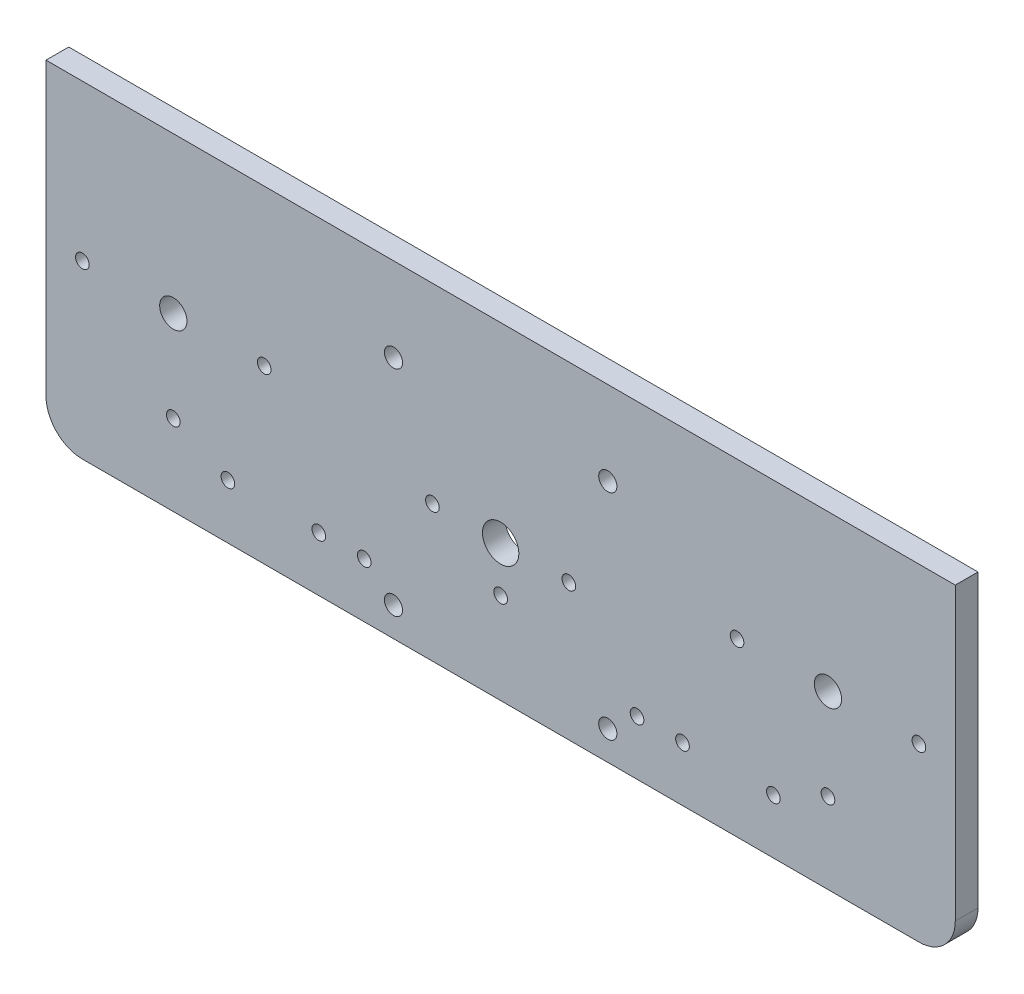
ISO-10303-21;
HEADER;
FILE_DESCRIPTION(('STEP AP214'),'2;1');
FILE_NAME('part.step','',(''),(''),'','','');
FILE_SCHEMA(('AUTOMOTIVE_DESIGN { 1 0 10303 214 1 1 1 1 }'));
ENDSEC;
DATA;
#1=APPLICATION_CONTEXT('core data for automotive mechanical design processes');
#2=APPLICATION_PROTOCOL_DEFINITION('international standard','automotive_design',2000,#1);
#3=PRODUCT_CONTEXT('',#1,'mechanical');
#4=PRODUCT('Part','Part','',(#3));
#5=PRODUCT_RELATED_PRODUCT_CATEGORY('part','',(#4));
#6=PRODUCT_DEFINITION_FORMATION('','',#4);
#7=PRODUCT_DEFINITION_CONTEXT('part definition',#1,'design');
#8=PRODUCT_DEFINITION('design','',#6,#7);
#9=PRODUCT_DEFINITION_SHAPE('','',#8);
#10=(LENGTH_UNIT() NAMED_UNIT(*) SI_UNIT(.MILLI.,.METRE.));
#11=(NAMED_UNIT(*) PLANE_ANGLE_UNIT() SI_UNIT($,.RADIAN.));
#12=(NAMED_UNIT(*) SI_UNIT($,.STERADIAN.) SOLID_ANGLE_UNIT());
#13=UNCERTAINTY_MEASURE_WITH_UNIT(LENGTH_MEASURE(1.E-05),#10,'distance_accuracy_value','');
#14=(GEOMETRIC_REPRESENTATION_CONTEXT(3) GLOBAL_UNCERTAINTY_ASSIGNED_CONTEXT((#13)) GLOBAL_UNIT_ASSIGNED_CONTEXT((#10,
#11,#12)) REPRESENTATION_CONTEXT('',''));
#15=CARTESIAN_POINT('',(0.,0.,0.));
#16=DIRECTION('',(0.,0.,1.));
#17=DIRECTION('',(1.,0.,0.));
#18=AXIS2_PLACEMENT_3D('',#15,#16,#17);
#19=CARTESIAN_POINT('',(-97.9315128409912,0.,5.));
#20=DIRECTION('',(1.,0.,0.));
#21=DIRECTION('',(0.,0.,-1.));
#22=AXIS2_PLACEMENT_3D('',#19,#20,#21);
#23=PLANE('',#22);
#24=DIRECTION('',(0.,-1.,0.));
#25=VECTOR('',#24,1.);
#26=CARTESIAN_POINT('',(-97.9315128409912,0.,0.));
#27=LINE('',#26,#25);
#28=CARTESIAN_POINT('',(-97.9315128409912,14.6727220693358,0.));
#29=VERTEX_POINT('',#28);
#30=CARTESIAN_POINT('',(-97.9315128409912,-49.3272779306642,0.));
#31=VERTEX_POINT('',#30);
#32=EDGE_CURVE('E190',#29,#31,#27,.T.);
#33=ORIENTED_EDGE('',*,*,#32,.T.);
#34=DIRECTION('',(0.,0.,-1.));
#35=VECTOR('',#34,1.);
#36=CARTESIAN_POINT('',(-97.9315128409912,-49.3272779306642,5.));
#37=LINE('',#36,#35);
#38=CARTESIAN_POINT('',(-97.9315128409912,-49.3272779306642,5.));
#39=VERTEX_POINT('',#38);
#40=EDGE_CURVE('E11',#39,#31,#37,.T.);
#41=ORIENTED_EDGE('',*,*,#40,.F.);
#42=DIRECTION('',(0.,-1.,0.));
#43=VECTOR('',#42,1.);
#44=CARTESIAN_POINT('',(-97.9315128409912,0.,5.));
#45=LINE('',#44,#43);
#46=CARTESIAN_POINT('',(-97.9315128409912,14.6727220693358,5.));
#47=VERTEX_POINT('',#46);
#48=EDGE_CURVE('E660',#47,#39,#45,.T.);
#49=ORIENTED_EDGE('',*,*,#48,.F.);
#50=DIRECTION('',(0.,0.,-1.));
#51=VECTOR('',#50,1.);
#52=CARTESIAN_POINT('',(-97.9315128409912,14.6727220693358,5.));
#53=LINE('',#52,#51);
#54=EDGE_CURVE('E55',#47,#29,#53,.T.);
#55=ORIENTED_EDGE('',*,*,#54,.T.);
#56=EDGE_LOOP('',(#33,#41,#49,#55));
#57=FACE_BOUND('',#56,.T.);
#58=ADVANCED_FACE('F38',(#57),#23,.F.);
#59=CARTESIAN_POINT('',(-89.9315128409912,-49.3272779306642,5.));
#60=DIRECTION('',(0.,0.,-1.));
#61=DIRECTION('',(-1.,0.,0.));
#62=AXIS2_PLACEMENT_3D('',#59,#60,#61);
#63=CYLINDRICAL_SURFACE('',#62,8.);
#64=CARTESIAN_POINT('',(-89.9315128409912,-49.3272779306642,0.));
#65=DIRECTION('',(0.,0.,1.));
#66=DIRECTION('',(1.,0.,0.));
#67=AXIS2_PLACEMENT_3D('',#64,#65,#66);
#68=CIRCLE('',#67,8.);
#69=CARTESIAN_POINT('',(-89.9315128409912,-57.3272779306642,0.));
#70=VERTEX_POINT('',#69);
#71=EDGE_CURVE('E192',#31,#70,#68,.T.);
#72=ORIENTED_EDGE('',*,*,#71,.T.);
#73=DIRECTION('',(0.,0.,-1.));
#74=VECTOR('',#73,1.);
#75=CARTESIAN_POINT('',(-89.9315128409912,-57.3272779306642,5.));
#76=LINE('',#75,#74);
#77=CARTESIAN_POINT('',(-89.9315128409912,-57.3272779306642,5.));
#78=VERTEX_POINT('',#77);
#79=EDGE_CURVE('E47',#78,#70,#76,.T.);
#80=ORIENTED_EDGE('',*,*,#79,.F.);
#81=CARTESIAN_POINT('',(-89.9315128409912,-49.3272779306642,5.));
#82=DIRECTION('',(0.,0.,1.));
#83=DIRECTION('',(1.,0.,0.));
#84=AXIS2_PLACEMENT_3D('',#81,#82,#83);
#85=CIRCLE('',#84,8.);
#86=EDGE_CURVE('E87',#39,#78,#85,.T.);
#87=ORIENTED_EDGE('',*,*,#86,.F.);
#88=ORIENTED_EDGE('',*,*,#40,.T.);
#89=EDGE_LOOP('',(#72,#80,#87,#88));
#90=FACE_BOUND('',#89,.T.);
#91=ADVANCED_FACE('F228',(#90),#63,.T.);
#92=CARTESIAN_POINT('',(0.,-57.3272779306642,5.));
#93=DIRECTION('',(0.,-1.,0.));
#94=DIRECTION('',(1.,0.,0.));
#95=AXIS2_PLACEMENT_3D('',#92,#93,#94);
#96=PLANE('',#95);
#97=DIRECTION('',(-1.,0.,0.));
#98=VECTOR('',#97,1.);
#99=CARTESIAN_POINT('',(0.,-57.3272779306642,0.));
#100=LINE('',#99,#98);
#101=CARTESIAN_POINT('',(94.0684871590088,-57.3272779306642,0.));
#102=VERTEX_POINT('',#101);
#103=EDGE_CURVE('E195',#102,#70,#100,.T.);
#104=ORIENTED_EDGE('',*,*,#103,.F.);
#105=DIRECTION('',(0.,0.,-1.));
#106=VECTOR('',#105,1.);
#107=CARTESIAN_POINT('',(94.0684871590088,-57.3272779306642,5.));
#108=LINE('',#107,#106);
#109=CARTESIAN_POINT('',(94.0684871590088,-57.3272779306642,5.));
#110=VERTEX_POINT('',#109);
#111=EDGE_CURVE('E106',#110,#102,#108,.T.);
#112=ORIENTED_EDGE('',*,*,#111,.F.);
#113=DIRECTION('',(-1.,0.,0.));
#114=VECTOR('',#113,1.);
#115=CARTESIAN_POINT('',(0.,-57.3272779306642,5.));
#116=LINE('',#115,#114);
#117=EDGE_CURVE('E116',#110,#78,#116,.T.);
#118=ORIENTED_EDGE('',*,*,#117,.T.);
#119=ORIENTED_EDGE('',*,*,#79,.T.);
#120=EDGE_LOOP('',(#104,#112,#118,#119));
#121=FACE_BOUND('',#120,.T.);
#122=ADVANCED_FACE('F227',(#121),#96,.T.);
#123=CARTESIAN_POINT('',(94.0684871590088,-49.3272779306642,5.));
#124=DIRECTION('',(0.,0.,-1.));
#125=DIRECTION('',(-1.,0.,0.));
#126=AXIS2_PLACEMENT_3D('',#123,#124,#125);
#127=CYLINDRICAL_SURFACE('',#126,8.);
#128=CARTESIAN_POINT('',(94.0684871590088,-49.3272779306642,0.));
#129=DIRECTION('',(0.,0.,1.));
#130=DIRECTION('',(1.,0.,0.));
#131=AXIS2_PLACEMENT_3D('',#128,#129,#130);
#132=CIRCLE('',#131,8.);
#133=CARTESIAN_POINT('',(102.068487159009,-49.3272779306642,0.));
#134=VERTEX_POINT('',#133);
#135=EDGE_CURVE('E102',#134,#102,#132,.F.);
#136=ORIENTED_EDGE('',*,*,#135,.F.);
#137=DIRECTION('',(0.,0.,-1.));
#138=VECTOR('',#137,1.);
#139=CARTESIAN_POINT('',(102.068487159009,-49.3272779306642,5.));
#140=LINE('',#139,#138);
#141=CARTESIAN_POINT('',(102.068487159009,-49.3272779306642,5.));
#142=VERTEX_POINT('',#141);
#143=EDGE_CURVE('E97',#142,#134,#140,.T.);
#144=ORIENTED_EDGE('',*,*,#143,.F.);
#145=CARTESIAN_POINT('',(94.0684871590088,-49.3272779306642,5.));
#146=DIRECTION('',(0.,0.,1.));
#147=DIRECTION('',(1.,0.,0.));
#148=AXIS2_PLACEMENT_3D('',#145,#146,#147);
#149=CIRCLE('',#148,8.);
#150=EDGE_CURVE('E100',#142,#110,#149,.F.);
#151=ORIENTED_EDGE('',*,*,#150,.T.);
#152=ORIENTED_EDGE('',*,*,#111,.T.);
#153=EDGE_LOOP('',(#136,#144,#151,#152));
#154=FACE_BOUND('',#153,.T.);
#155=ADVANCED_FACE('F99',(#154),#127,.T.);
#156=CARTESIAN_POINT('',(102.068487159009,0.,5.));
#157=DIRECTION('',(1.,0.,0.));
#158=DIRECTION('',(0.,0.,-1.));
#159=AXIS2_PLACEMENT_3D('',#156,#157,#158);
#160=PLANE('',#159);
#161=DIRECTION('',(0.,-1.,0.));
#162=VECTOR('',#161,1.);
#163=CARTESIAN_POINT('',(102.068487159009,0.,0.));
#164=LINE('',#163,#162);
#165=CARTESIAN_POINT('',(102.068487159009,14.6727220693358,0.));
#166=VERTEX_POINT('',#165);
#167=EDGE_CURVE('E199',#166,#134,#164,.T.);
#168=ORIENTED_EDGE('',*,*,#167,.F.);
#169=DIRECTION('',(0.,0.,-1.));
#170=VECTOR('',#169,1.);
#171=CARTESIAN_POINT('',(102.068487159009,14.6727220693358,5.));
#172=LINE('',#171,#170);
#173=CARTESIAN_POINT('',(102.068487159009,14.6727220693358,5.));
#174=VERTEX_POINT('',#173);
#175=EDGE_CURVE('E75',#174,#166,#172,.T.);
#176=ORIENTED_EDGE('',*,*,#175,.F.);
#177=DIRECTION('',(0.,-1.,0.));
#178=VECTOR('',#177,1.);
#179=CARTESIAN_POINT('',(102.068487159009,0.,5.));
#180=LINE('',#179,#178);
#181=EDGE_CURVE('E114',#174,#142,#180,.T.);
#182=ORIENTED_EDGE('',*,*,#181,.T.);
#183=ORIENTED_EDGE('',*,*,#143,.T.);
#184=EDGE_LOOP('',(#168,#176,#182,#183));
#185=FACE_BOUND('',#184,.T.);
#186=ADVANCED_FACE('F118',(#185),#160,.T.);
#187=CARTESIAN_POINT('',(32.0684871590088,-45.3272779306642,5.));
#188=DIRECTION('',(0.,0.,-1.));
#189=DIRECTION('',(-1.,0.,0.));
#190=AXIS2_PLACEMENT_3D('',#187,#188,#189);
#191=CYLINDRICAL_SURFACE('',#190,1.5);
#192=CARTESIAN_POINT('',(32.0684871590088,-45.3272779306642,5.));
#193=DIRECTION('',(0.,0.,1.));
#194=DIRECTION('',(1.,0.,0.));
#195=AXIS2_PLACEMENT_3D('',#192,#193,#194);
#196=CIRCLE('',#195,1.5);
#197=CARTESIAN_POINT('',(33.5684871590088,-45.3272779306642,5.));
#198=VERTEX_POINT('',#197);
#199=EDGE_CURVE('E136',#198,#198,#196,.T.);
#200=ORIENTED_EDGE('',*,*,#199,.T.);
#201=EDGE_LOOP('',(#200));
#202=FACE_BOUND('',#201,.T.);
#203=CARTESIAN_POINT('',(32.0684871590088,-45.3272779306642,0.));
#204=DIRECTION('',(0.,0.,1.));
#205=DIRECTION('',(1.,0.,0.));
#206=AXIS2_PLACEMENT_3D('',#203,#204,#205);
#207=CIRCLE('',#206,1.5);
#208=CARTESIAN_POINT('',(33.5684871590088,-45.3272779306642,0.));
#209=VERTEX_POINT('',#208);
#210=EDGE_CURVE('E216',#209,#209,#207,.T.);
#211=ORIENTED_EDGE('',*,*,#210,.F.);
#212=EDGE_LOOP('',(#211));
#213=FACE_BOUND('',#212,.T.);
#214=ADVANCED_FACE('F376',(#202,#213),#191,.F.);
#215=CARTESIAN_POINT('',(25.6384871590088,-3.75727793066421,5.));
#216=DIRECTION('',(0.,0.,-1.));
#217=DIRECTION('',(-1.,0.,0.));
#218=AXIS2_PLACEMENT_3D('',#215,#216,#217);
#219=CYLINDRICAL_SURFACE('',#218,2.);
#220=CARTESIAN_POINT('',(25.6384871590088,-3.75727793066421,5.));
#221=DIRECTION('',(0.,0.,1.));
#222=DIRECTION('',(1.,0.,0.));
#223=AXIS2_PLACEMENT_3D('',#220,#221,#222);
#224=CIRCLE('',#223,2.);
#225=CARTESIAN_POINT('',(27.6384871590088,-3.75727793066421,5.));
#226=VERTEX_POINT('',#225);
#227=EDGE_CURVE('E133',#226,#226,#224,.F.);
#228=ORIENTED_EDGE('',*,*,#227,.F.);
#229=EDGE_LOOP('',(#228));
#230=FACE_BOUND('',#229,.T.);
#231=CARTESIAN_POINT('',(25.6384871590088,-3.75727793066421,0.));
#232=DIRECTION('',(0.,0.,1.));
#233=DIRECTION('',(1.,0.,0.));
#234=AXIS2_PLACEMENT_3D('',#231,#232,#233);
#235=CIRCLE('',#234,2.);
#236=CARTESIAN_POINT('',(27.6384871590088,-3.75727793066421,0.));
#237=VERTEX_POINT('',#236);
#238=EDGE_CURVE('E213',#237,#237,#235,.F.);
#239=ORIENTED_EDGE('',*,*,#238,.T.);
#240=EDGE_LOOP('',(#239));
#241=FACE_BOUND('',#240,.T.);
#242=ADVANCED_FACE('F379',(#230,#241),#219,.F.);
#243=CARTESIAN_POINT('',(-21.5015128409912,-3.75727793066421,5.));
#244=DIRECTION('',(0.,0.,-1.));
#245=DIRECTION('',(-1.,0.,0.));
#246=AXIS2_PLACEMENT_3D('',#243,#244,#245);
#247=CYLINDRICAL_SURFACE('',#246,2.);
#248=CARTESIAN_POINT('',(-21.5015128409912,-3.75727793066421,5.));
#249=DIRECTION('',(0.,0.,1.));
#250=DIRECTION('',(1.,0.,0.));
#251=AXIS2_PLACEMENT_3D('',#248,#249,#250);
#252=CIRCLE('',#251,2.);
#253=CARTESIAN_POINT('',(-19.5015128409912,-3.75727793066421,5.));
#254=VERTEX_POINT('',#253);
#255=EDGE_CURVE('E130',#254,#254,#252,.T.);
#256=ORIENTED_EDGE('',*,*,#255,.T.);
#257=EDGE_LOOP('',(#256));
#258=FACE_BOUND('',#257,.T.);
#259=CARTESIAN_POINT('',(-21.5015128409912,-3.75727793066421,0.));
#260=DIRECTION('',(0.,0.,1.));
#261=DIRECTION('',(1.,0.,0.));
#262=AXIS2_PLACEMENT_3D('',#259,#260,#261);
#263=CIRCLE('',#262,2.);
#264=CARTESIAN_POINT('',(-19.5015128409912,-3.75727793066421,0.));
#265=VERTEX_POINT('',#264);
#266=EDGE_CURVE('E210',#265,#265,#263,.T.);
#267=ORIENTED_EDGE('',*,*,#266,.F.);
#268=EDGE_LOOP('',(#267));
#269=FACE_BOUND('',#268,.T.);
#270=ADVANCED_FACE('F383',(#258,#269),#247,.F.);
#271=CARTESIAN_POINT('',(2.06848715900879,-37.3272779306642,5.));
#272=DIRECTION('',(0.,0.,-1.));
#273=DIRECTION('',(-1.,0.,0.));
#274=AXIS2_PLACEMENT_3D('',#271,#272,#273);
#275=CYLINDRICAL_SURFACE('',#274,1.5);
#276=CARTESIAN_POINT('',(2.06848715900879,-37.3272779306642,5.));
#277=DIRECTION('',(0.,0.,1.));
#278=DIRECTION('',(1.,0.,0.));
#279=AXIS2_PLACEMENT_3D('',#276,#277,#278);
#280=CIRCLE('',#279,1.5);
#281=CARTESIAN_POINT('',(3.56848715900879,-37.3272779306642,5.));
#282=VERTEX_POINT('',#281);
#283=EDGE_CURVE('E127',#282,#282,#280,.T.);
#284=ORIENTED_EDGE('',*,*,#283,.T.);
#285=EDGE_LOOP('',(#284));
#286=FACE_BOUND('',#285,.T.);
#287=CARTESIAN_POINT('',(2.06848715900879,-37.3272779306642,0.));
#288=DIRECTION('',(0.,0.,1.));
#289=DIRECTION('',(1.,0.,0.));
#290=AXIS2_PLACEMENT_3D('',#287,#288,#289);
#291=CIRCLE('',#290,1.5);
#292=CARTESIAN_POINT('',(3.56848715900879,-37.3272779306642,0.));
#293=VERTEX_POINT('',#292);
#294=EDGE_CURVE('E207',#293,#293,#291,.T.);
#295=ORIENTED_EDGE('',*,*,#294,.F.);
#296=EDGE_LOOP('',(#295));
#297=FACE_BOUND('',#296,.T.);
#298=ADVANCED_FACE('F245',(#286,#297),#275,.F.);
#299=CARTESIAN_POINT('',(-37.9315128409912,-45.3272779306642,5.));
#300=DIRECTION('',(0.,0.,-1.));
#301=DIRECTION('',(-1.,0.,0.));
#302=AXIS2_PLACEMENT_3D('',#299,#300,#301);
#303=CYLINDRICAL_SURFACE('',#302,1.5);
#304=CARTESIAN_POINT('',(-37.9315128409912,-45.3272779306642,5.));
#305=DIRECTION('',(0.,0.,1.));
#306=DIRECTION('',(1.,0.,0.));
#307=AXIS2_PLACEMENT_3D('',#304,#305,#306);
#308=CIRCLE('',#307,1.5);
#309=CARTESIAN_POINT('',(-36.4315128409912,-45.3272779306642,5.));
#310=VERTEX_POINT('',#309);
#311=EDGE_CURVE('E121',#310,#310,#308,.F.);
#312=ORIENTED_EDGE('',*,*,#311,.F.);
#313=EDGE_LOOP('',(#312));
#314=FACE_BOUND('',#313,.T.);
#315=CARTESIAN_POINT('',(-37.9315128409912,-45.3272779306642,0.));
#316=DIRECTION('',(0.,0.,1.));
#317=DIRECTION('',(1.,0.,0.));
#318=AXIS2_PLACEMENT_3D('',#315,#316,#317);
#319=CIRCLE('',#318,1.5);
#320=CARTESIAN_POINT('',(-36.4315128409912,-45.3272779306642,0.));
#321=VERTEX_POINT('',#320);
#322=EDGE_CURVE('E204',#321,#321,#319,.F.);
#323=ORIENTED_EDGE('',*,*,#322,.T.);
#324=EDGE_LOOP('',(#323));
#325=FACE_BOUND('',#324,.T.);
#326=ADVANCED_FACE('F236',(#314,#325),#303,.F.);
#327=CARTESIAN_POINT('',(0.,14.6727220693358,5.));
#328=DIRECTION('',(0.,1.,0.));
#329=DIRECTION('',(0.,0.,1.));
#330=AXIS2_PLACEMENT_3D('',#327,#328,#329);
#331=PLANE('',#330);
#332=DIRECTION('',(1.,0.,0.));
#333=VECTOR('',#332,1.);
#334=CARTESIAN_POINT('',(0.,14.6727220693358,0.));
#335=LINE('',#334,#333);
#336=EDGE_CURVE('E201',#29,#166,#335,.T.);
#337=ORIENTED_EDGE('',*,*,#336,.F.);
#338=ORIENTED_EDGE('',*,*,#54,.F.);
#339=DIRECTION('',(1.,0.,0.));
#340=VECTOR('',#339,1.);
#341=CARTESIAN_POINT('',(0.,14.6727220693358,5.));
#342=LINE('',#341,#340);
#343=EDGE_CURVE('E119',#47,#174,#342,.T.);
#344=ORIENTED_EDGE('',*,*,#343,.T.);
#345=ORIENTED_EDGE('',*,*,#175,.T.);
#346=EDGE_LOOP('',(#337,#338,#344,#345));
#347=FACE_BOUND('',#346,.T.);
#348=ADVANCED_FACE('F233',(#347),#331,.T.);
#349=CARTESIAN_POINT('',(-69.9315128409912,-39.5772779306642,5.));
#350=DIRECTION('',(0.,0.,-1.));
#351=DIRECTION('',(-1.,0.,0.));
#352=AXIS2_PLACEMENT_3D('',#349,#350,#351);
#353=CYLINDRICAL_SURFACE('',#352,1.5);
#354=CARTESIAN_POINT('',(-69.9315128409912,-39.5772779306642,5.));
#355=DIRECTION('',(0.,0.,1.));
#356=DIRECTION('',(1.,0.,0.));
#357=AXIS2_PLACEMENT_3D('',#354,#355,#356);
#358=CIRCLE('',#357,1.5);
#359=CARTESIAN_POINT('',(-68.4315128409912,-39.5772779306642,5.));
#360=VERTEX_POINT('',#359);
#361=EDGE_CURVE('E659',#360,#360,#358,.F.);
#362=ORIENTED_EDGE('',*,*,#361,.F.);
#363=EDGE_LOOP('',(#362));
#364=FACE_BOUND('',#363,.T.);
#365=CARTESIAN_POINT('',(-69.9315128409912,-39.5772779306642,0.));
#366=DIRECTION('',(0.,0.,1.));
#367=DIRECTION('',(1.,0.,0.));
#368=AXIS2_PLACEMENT_3D('',#365,#366,#367);
#369=CIRCLE('',#368,1.5);
#370=CARTESIAN_POINT('',(-68.4315128409912,-39.5772779306642,0.));
#371=VERTEX_POINT('',#370);
#372=EDGE_CURVE('E187',#371,#371,#369,.F.);
#373=ORIENTED_EDGE('',*,*,#372,.T.);
#374=EDGE_LOOP('',(#373));
#375=FACE_BOUND('',#374,.T.);
#376=ADVANCED_FACE('F235',(#364,#375),#353,.F.);
#377=CARTESIAN_POINT('',(-69.9315128409912,-19.5772779306642,5.));
#378=DIRECTION('',(0.,0.,-1.));
#379=DIRECTION('',(-1.,0.,0.));
#380=AXIS2_PLACEMENT_3D('',#377,#378,#379);
#381=CYLINDRICAL_SURFACE('',#380,3.00000000000001);
#382=CARTESIAN_POINT('',(-69.9315128409912,-19.5772779306642,5.));
#383=DIRECTION('',(0.,0.,1.));
#384=DIRECTION('',(1.,0.,0.));
#385=AXIS2_PLACEMENT_3D('',#382,#383,#384);
#386=CIRCLE('',#385,3.00000000000001);
#387=CARTESIAN_POINT('',(-66.9315128409912,-19.5772779306642,5.));
#388=VERTEX_POINT('',#387);
#389=EDGE_CURVE('E656',#388,#388,#386,.F.);
#390=ORIENTED_EDGE('',*,*,#389,.F.);
#391=EDGE_LOOP('',(#390));
#392=FACE_BOUND('',#391,.T.);
#393=CARTESIAN_POINT('',(-69.9315128409912,-19.5772779306642,0.));
#394=DIRECTION('',(0.,0.,1.));
#395=DIRECTION('',(1.,0.,0.));
#396=AXIS2_PLACEMENT_3D('',#393,#394,#395);
#397=CIRCLE('',#396,3.00000000000001);
#398=CARTESIAN_POINT('',(-66.9315128409912,-19.5772779306642,0.));
#399=VERTEX_POINT('',#398);
#400=EDGE_CURVE('E184',#399,#399,#397,.F.);
#401=ORIENTED_EDGE('',*,*,#400,.T.);
#402=EDGE_LOOP('',(#401));
#403=FACE_BOUND('',#402,.T.);
#404=ADVANCED_FACE('F242',(#392,#403),#381,.F.);
#405=CARTESIAN_POINT('',(74.0684871590088,-19.5772779306642,5.));
#406=DIRECTION('',(0.,0.,-1.));
#407=DIRECTION('',(-1.,0.,0.));
#408=AXIS2_PLACEMENT_3D('',#405,#406,#407);
#409=CYLINDRICAL_SURFACE('',#408,3.00000000000001);
#410=CARTESIAN_POINT('',(74.0684871590088,-19.5772779306642,5.));
#411=DIRECTION('',(0.,0.,1.));
#412=DIRECTION('',(1.,0.,0.));
#413=AXIS2_PLACEMENT_3D('',#410,#411,#412);
#414=CIRCLE('',#413,3.00000000000001);
#415=CARTESIAN_POINT('',(77.0684871590088,-19.5772779306642,5.));
#416=VERTEX_POINT('',#415);
#417=EDGE_CURVE('E652',#416,#416,#414,.T.);
#418=ORIENTED_EDGE('',*,*,#417,.T.);
#419=EDGE_LOOP('',(#418));
#420=FACE_BOUND('',#419,.T.);
#421=CARTESIAN_POINT('',(74.0684871590088,-19.5772779306642,0.));
#422=DIRECTION('',(0.,0.,1.));
#423=DIRECTION('',(1.,0.,0.));
#424=AXIS2_PLACEMENT_3D('',#421,#422,#423);
#425=CIRCLE('',#424,3.00000000000001);
#426=CARTESIAN_POINT('',(77.0684871590088,-19.5772779306642,0.));
#427=VERTEX_POINT('',#426);
#428=EDGE_CURVE('E181',#427,#427,#425,.T.);
#429=ORIENTED_EDGE('',*,*,#428,.F.);
#430=EDGE_LOOP('',(#429));
#431=FACE_BOUND('',#430,.T.);
#432=ADVANCED_FACE('F259',(#420,#431),#409,.F.);
#433=CARTESIAN_POINT('',(2.06848715900879,-27.3272779306642,5.));
#434=DIRECTION('',(0.,0.,-1.));
#435=DIRECTION('',(-1.,0.,0.));
#436=AXIS2_PLACEMENT_3D('',#433,#434,#435);
#437=CYLINDRICAL_SURFACE('',#436,4.);
#438=CARTESIAN_POINT('',(2.06848715900879,-27.3272779306642,5.));
#439=DIRECTION('',(0.,0.,1.));
#440=DIRECTION('',(1.,0.,0.));
#441=AXIS2_PLACEMENT_3D('',#438,#439,#440);
#442=CIRCLE('',#441,4.);
#443=CARTESIAN_POINT('',(6.06848715900879,-27.3272779306642,5.));
#444=VERTEX_POINT('',#443);
#445=EDGE_CURVE('E648',#444,#444,#442,.T.);
#446=ORIENTED_EDGE('',*,*,#445,.T.);
#447=EDGE_LOOP('',(#446));
#448=FACE_BOUND('',#447,.T.);
#449=CARTESIAN_POINT('',(2.06848715900879,-27.3272779306642,0.));
#450=DIRECTION('',(0.,0.,1.));
#451=DIRECTION('',(1.,0.,0.));
#452=AXIS2_PLACEMENT_3D('',#449,#450,#451);
#453=CIRCLE('',#452,4.);
#454=CARTESIAN_POINT('',(6.06848715900879,-27.3272779306642,0.));
#455=VERTEX_POINT('',#454);
#456=EDGE_CURVE('E178',#455,#455,#453,.T.);
#457=ORIENTED_EDGE('',*,*,#456,.F.);
#458=EDGE_LOOP('',(#457));
#459=FACE_BOUND('',#458,.T.);
#460=ADVANCED_FACE('F263',(#448,#459),#437,.F.);
#461=CARTESIAN_POINT('',(74.0684871590088,-39.5772779306642,5.));
#462=DIRECTION('',(0.,0.,-1.));
#463=DIRECTION('',(-1.,0.,0.));
#464=AXIS2_PLACEMENT_3D('',#461,#462,#463);
#465=CYLINDRICAL_SURFACE('',#464,1.5);
#466=CARTESIAN_POINT('',(74.0684871590088,-39.5772779306642,5.));
#467=DIRECTION('',(0.,0.,1.));
#468=DIRECTION('',(1.,0.,0.));
#469=AXIS2_PLACEMENT_3D('',#466,#467,#468);
#470=CIRCLE('',#469,1.5);
#471=CARTESIAN_POINT('',(75.5684871590088,-39.5772779306642,5.));
#472=VERTEX_POINT('',#471);
#473=EDGE_CURVE('E644',#472,#472,#470,.T.);
#474=ORIENTED_EDGE('',*,*,#473,.T.);
#475=EDGE_LOOP('',(#474));
#476=FACE_BOUND('',#475,.T.);
#477=CARTESIAN_POINT('',(74.0684871590088,-39.5772779306642,0.));
#478=DIRECTION('',(0.,0.,1.));
#479=DIRECTION('',(1.,0.,0.));
#480=AXIS2_PLACEMENT_3D('',#477,#478,#479);
#481=CIRCLE('',#480,1.5);
#482=CARTESIAN_POINT('',(75.5684871590088,-39.5772779306642,0.));
#483=VERTEX_POINT('',#482);
#484=EDGE_CURVE('E175',#483,#483,#481,.T.);
#485=ORIENTED_EDGE('',*,*,#484,.F.);
#486=EDGE_LOOP('',(#485));
#487=FACE_BOUND('',#486,.T.);
#488=ADVANCED_FACE('F267',(#476,#487),#465,.F.);
#489=CARTESIAN_POINT('',(54.0684871590088,-19.5772779306642,5.));
#490=DIRECTION('',(0.,0.,-1.));
#491=DIRECTION('',(-1.,0.,0.));
#492=AXIS2_PLACEMENT_3D('',#489,#490,#491);
#493=CYLINDRICAL_SURFACE('',#492,1.5);
#494=CARTESIAN_POINT('',(54.0684871590088,-19.5772779306642,5.));
#495=DIRECTION('',(0.,0.,1.));
#496=DIRECTION('',(1.,0.,0.));
#497=AXIS2_PLACEMENT_3D('',#494,#495,#496);
#498=CIRCLE('',#497,1.5);
#499=CARTESIAN_POINT('',(55.5684871590088,-19.5772779306642,5.));
#500=VERTEX_POINT('',#499);
#501=EDGE_CURVE('E640',#500,#500,#498,.T.);
#502=ORIENTED_EDGE('',*,*,#501,.T.);
#503=EDGE_LOOP('',(#502));
#504=FACE_BOUND('',#503,.T.);
#505=CARTESIAN_POINT('',(54.0684871590088,-19.5772779306642,0.));
#506=DIRECTION('',(0.,0.,1.));
#507=DIRECTION('',(1.,0.,0.));
#508=AXIS2_PLACEMENT_3D('',#505,#506,#507);
#509=CIRCLE('',#508,1.5);
#510=CARTESIAN_POINT('',(55.5684871590088,-19.5772779306642,0.));
#511=VERTEX_POINT('',#510);
#512=EDGE_CURVE('E172',#511,#511,#509,.T.);
#513=ORIENTED_EDGE('',*,*,#512,.F.);
#514=EDGE_LOOP('',(#513));
#515=FACE_BOUND('',#514,.T.);
#516=ADVANCED_FACE('F271',(#504,#515),#493,.F.);
#517=CARTESIAN_POINT('',(94.0684871590088,-19.5772779306642,5.));
#518=DIRECTION('',(0.,0.,-1.));
#519=DIRECTION('',(-1.,0.,0.));
#520=AXIS2_PLACEMENT_3D('',#517,#518,#519);
#521=CYLINDRICAL_SURFACE('',#520,1.5);
#522=CARTESIAN_POINT('',(94.0684871590088,-19.5772779306642,5.));
#523=DIRECTION('',(0.,0.,1.));
#524=DIRECTION('',(1.,0.,0.));
#525=AXIS2_PLACEMENT_3D('',#522,#523,#524);
#526=CIRCLE('',#525,1.5);
#527=CARTESIAN_POINT('',(95.5684871590088,-19.5772779306642,5.));
#528=VERTEX_POINT('',#527);
#529=EDGE_CURVE('E636',#528,#528,#526,.F.);
#530=ORIENTED_EDGE('',*,*,#529,.F.);
#531=EDGE_LOOP('',(#530));
#532=FACE_BOUND('',#531,.T.);
#533=CARTESIAN_POINT('',(94.0684871590088,-19.5772779306642,0.));
#534=DIRECTION('',(0.,0.,1.));
#535=DIRECTION('',(1.,0.,0.));
#536=AXIS2_PLACEMENT_3D('',#533,#534,#535);
#537=CIRCLE('',#536,1.5);
#538=CARTESIAN_POINT('',(95.5684871590088,-19.5772779306642,0.));
#539=VERTEX_POINT('',#538);
#540=EDGE_CURVE('E169',#539,#539,#537,.F.);
#541=ORIENTED_EDGE('',*,*,#540,.T.);
#542=EDGE_LOOP('',(#541));
#543=FACE_BOUND('',#542,.T.);
#544=ADVANCED_FACE('F275',(#532,#543),#521,.F.);
#545=CARTESIAN_POINT('',(-89.9315128409912,-19.5772779306642,5.));
#546=DIRECTION('',(0.,0.,-1.));
#547=DIRECTION('',(-1.,0.,0.));
#548=AXIS2_PLACEMENT_3D('',#545,#546,#547);
#549=CYLINDRICAL_SURFACE('',#548,1.5);
#550=CARTESIAN_POINT('',(-89.9315128409912,-19.5772779306642,5.));
#551=DIRECTION('',(0.,0.,1.));
#552=DIRECTION('',(1.,0.,0.));
#553=AXIS2_PLACEMENT_3D('',#550,#551,#552);
#554=CIRCLE('',#553,1.5);
#555=CARTESIAN_POINT('',(-88.4315128409912,-19.5772779306642,5.));
#556=VERTEX_POINT('',#555);
#557=EDGE_CURVE('E632',#556,#556,#554,.T.);
#558=ORIENTED_EDGE('',*,*,#557,.T.);
#559=EDGE_LOOP('',(#558));
#560=FACE_BOUND('',#559,.T.);
#561=CARTESIAN_POINT('',(-89.9315128409912,-19.5772779306642,0.));
#562=DIRECTION('',(0.,0.,1.));
#563=DIRECTION('',(1.,0.,0.));
#564=AXIS2_PLACEMENT_3D('',#561,#562,#563);
#565=CIRCLE('',#564,1.5);
#566=CARTESIAN_POINT('',(-88.4315128409912,-19.5772779306642,0.));
#567=VERTEX_POINT('',#566);
#568=EDGE_CURVE('E166',#567,#567,#565,.T.);
#569=ORIENTED_EDGE('',*,*,#568,.F.);
#570=EDGE_LOOP('',(#569));
#571=FACE_BOUND('',#570,.T.);
#572=ADVANCED_FACE('F279',(#560,#571),#549,.F.);
#573=CARTESIAN_POINT('',(-49.9315128409912,-19.5772779306642,5.));
#574=DIRECTION('',(0.,0.,-1.));
#575=DIRECTION('',(-1.,0.,0.));
#576=AXIS2_PLACEMENT_3D('',#573,#574,#575);
#577=CYLINDRICAL_SURFACE('',#576,1.5);
#578=CARTESIAN_POINT('',(-49.9315128409912,-19.5772779306642,5.));
#579=DIRECTION('',(0.,0.,1.));
#580=DIRECTION('',(1.,0.,0.));
#581=AXIS2_PLACEMENT_3D('',#578,#579,#580);
#582=CIRCLE('',#581,1.5);
#583=CARTESIAN_POINT('',(-48.4315128409912,-19.5772779306642,5.));
#584=VERTEX_POINT('',#583);
#585=EDGE_CURVE('E628',#584,#584,#582,.F.);
#586=ORIENTED_EDGE('',*,*,#585,.F.);
#587=EDGE_LOOP('',(#586));
#588=FACE_BOUND('',#587,.T.);
#589=CARTESIAN_POINT('',(-49.9315128409912,-19.5772779306642,0.));
#590=DIRECTION('',(0.,0.,1.));
#591=DIRECTION('',(1.,0.,0.));
#592=AXIS2_PLACEMENT_3D('',#589,#590,#591);
#593=CIRCLE('',#592,1.5);
#594=CARTESIAN_POINT('',(-48.4315128409912,-19.5772779306642,0.));
#595=VERTEX_POINT('',#594);
#596=EDGE_CURVE('E163',#595,#595,#593,.F.);
#597=ORIENTED_EDGE('',*,*,#596,.T.);
#598=EDGE_LOOP('',(#597));
#599=FACE_BOUND('',#598,.T.);
#600=ADVANCED_FACE('F283',(#588,#599),#577,.F.);
#601=CARTESIAN_POINT('',(42.0684871590088,-45.3272779306642,5.));
#602=DIRECTION('',(0.,0.,-1.));
#603=DIRECTION('',(-1.,0.,0.));
#604=AXIS2_PLACEMENT_3D('',#601,#602,#603);
#605=CYLINDRICAL_SURFACE('',#604,1.5);
#606=CARTESIAN_POINT('',(42.0684871590088,-45.3272779306642,5.));
#607=DIRECTION('',(0.,0.,1.));
#608=DIRECTION('',(1.,0.,0.));
#609=AXIS2_PLACEMENT_3D('',#606,#607,#608);
#610=CIRCLE('',#609,1.5);
#611=CARTESIAN_POINT('',(43.5684871590088,-45.3272779306642,5.));
#612=VERTEX_POINT('',#611);
#613=EDGE_CURVE('E624',#612,#612,#610,.T.);
#614=ORIENTED_EDGE('',*,*,#613,.T.);
#615=EDGE_LOOP('',(#614));
#616=FACE_BOUND('',#615,.T.);
#617=CARTESIAN_POINT('',(42.0684871590088,-45.3272779306642,0.));
#618=DIRECTION('',(0.,0.,1.));
#619=DIRECTION('',(1.,0.,0.));
#620=AXIS2_PLACEMENT_3D('',#617,#618,#619);
#621=CIRCLE('',#620,1.5);
#622=CARTESIAN_POINT('',(43.5684871590088,-45.3272779306642,0.));
#623=VERTEX_POINT('',#622);
#624=EDGE_CURVE('E160',#623,#623,#621,.T.);
#625=ORIENTED_EDGE('',*,*,#624,.F.);
#626=EDGE_LOOP('',(#625));
#627=FACE_BOUND('',#626,.T.);
#628=ADVANCED_FACE('F287',(#616,#627),#605,.F.);
#629=CARTESIAN_POINT('',(62.0684871590088,-45.3272779306642,5.));
#630=DIRECTION('',(0.,0.,-1.));
#631=DIRECTION('',(-1.,0.,0.));
#632=AXIS2_PLACEMENT_3D('',#629,#630,#631);
#633=CYLINDRICAL_SURFACE('',#632,1.5);
#634=CARTESIAN_POINT('',(62.0684871590088,-45.3272779306642,5.));
#635=DIRECTION('',(0.,0.,1.));
#636=DIRECTION('',(1.,0.,0.));
#637=AXIS2_PLACEMENT_3D('',#634,#635,#636);
#638=CIRCLE('',#637,1.5);
#639=CARTESIAN_POINT('',(63.5684871590088,-45.3272779306642,5.));
#640=VERTEX_POINT('',#639);
#641=EDGE_CURVE('E620',#640,#640,#638,.T.);
#642=ORIENTED_EDGE('',*,*,#641,.T.);
#643=EDGE_LOOP('',(#642));
#644=FACE_BOUND('',#643,.T.);
#645=CARTESIAN_POINT('',(62.0684871590088,-45.3272779306642,0.));
#646=DIRECTION('',(0.,0.,1.));
#647=DIRECTION('',(1.,0.,0.));
#648=AXIS2_PLACEMENT_3D('',#645,#646,#647);
#649=CIRCLE('',#648,1.5);
#650=CARTESIAN_POINT('',(63.5684871590088,-45.3272779306642,0.));
#651=VERTEX_POINT('',#650);
#652=EDGE_CURVE('E157',#651,#651,#649,.T.);
#653=ORIENTED_EDGE('',*,*,#652,.F.);
#654=EDGE_LOOP('',(#653));
#655=FACE_BOUND('',#654,.T.);
#656=ADVANCED_FACE('F291',(#644,#655),#633,.F.);
#657=CARTESIAN_POINT('',(-57.9315128409912,-45.3272779306642,5.));
#658=DIRECTION('',(0.,0.,-1.));
#659=DIRECTION('',(-1.,0.,0.));
#660=AXIS2_PLACEMENT_3D('',#657,#658,#659);
#661=CYLINDRICAL_SURFACE('',#660,1.5);
#662=CARTESIAN_POINT('',(-57.9315128409912,-45.3272779306642,5.));
#663=DIRECTION('',(0.,0.,1.));
#664=DIRECTION('',(1.,0.,0.));
#665=AXIS2_PLACEMENT_3D('',#662,#663,#664);
#666=CIRCLE('',#665,1.5);
#667=CARTESIAN_POINT('',(-56.4315128409912,-45.3272779306642,5.));
#668=VERTEX_POINT('',#667);
#669=EDGE_CURVE('E616',#668,#668,#666,.F.);
#670=ORIENTED_EDGE('',*,*,#669,.F.);
#671=EDGE_LOOP('',(#670));
#672=FACE_BOUND('',#671,.T.);
#673=CARTESIAN_POINT('',(-57.9315128409912,-45.3272779306642,0.));
#674=DIRECTION('',(0.,0.,1.));
#675=DIRECTION('',(1.,0.,0.));
#676=AXIS2_PLACEMENT_3D('',#673,#674,#675);
#677=CIRCLE('',#676,1.5);
#678=CARTESIAN_POINT('',(-56.4315128409912,-45.3272779306642,0.));
#679=VERTEX_POINT('',#678);
#680=EDGE_CURVE('E154',#679,#679,#677,.F.);
#681=ORIENTED_EDGE('',*,*,#680,.T.);
#682=EDGE_LOOP('',(#681));
#683=FACE_BOUND('',#682,.T.);
#684=ADVANCED_FACE('F295',(#672,#683),#661,.F.);
#685=CARTESIAN_POINT('',(-12.9315128409912,-27.3272779306642,5.));
#686=DIRECTION('',(0.,0.,-1.));
#687=DIRECTION('',(-1.,0.,0.));
#688=AXIS2_PLACEMENT_3D('',#685,#686,#687);
#689=CYLINDRICAL_SURFACE('',#688,1.5);
#690=CARTESIAN_POINT('',(-12.9315128409912,-27.3272779306642,5.));
#691=DIRECTION('',(0.,0.,1.));
#692=DIRECTION('',(1.,0.,0.));
#693=AXIS2_PLACEMENT_3D('',#690,#691,#692);
#694=CIRCLE('',#693,1.5);
#695=CARTESIAN_POINT('',(-11.4315128409912,-27.3272779306642,5.));
#696=VERTEX_POINT('',#695);
#697=EDGE_CURVE('E612',#696,#696,#694,.T.);
#698=ORIENTED_EDGE('',*,*,#697,.T.);
#699=EDGE_LOOP('',(#698));
#700=FACE_BOUND('',#699,.T.);
#701=CARTESIAN_POINT('',(-12.9315128409912,-27.3272779306642,0.));
#702=DIRECTION('',(0.,0.,1.));
#703=DIRECTION('',(1.,0.,0.));
#704=AXIS2_PLACEMENT_3D('',#701,#702,#703);
#705=CIRCLE('',#704,1.5);
#706=CARTESIAN_POINT('',(-11.4315128409912,-27.3272779306642,0.));
#707=VERTEX_POINT('',#706);
#708=EDGE_CURVE('E151',#707,#707,#705,.T.);
#709=ORIENTED_EDGE('',*,*,#708,.F.);
#710=EDGE_LOOP('',(#709));
#711=FACE_BOUND('',#710,.T.);
#712=ADVANCED_FACE('F299',(#700,#711),#689,.F.);
#713=CARTESIAN_POINT('',(17.0684871590088,-27.3272779306642,5.));
#714=DIRECTION('',(0.,0.,-1.));
#715=DIRECTION('',(-1.,0.,0.));
#716=AXIS2_PLACEMENT_3D('',#713,#714,#715);
#717=CYLINDRICAL_SURFACE('',#716,1.5);
#718=CARTESIAN_POINT('',(17.0684871590088,-27.3272779306642,5.));
#719=DIRECTION('',(0.,0.,1.));
#720=DIRECTION('',(1.,0.,0.));
#721=AXIS2_PLACEMENT_3D('',#718,#719,#720);
#722=CIRCLE('',#721,1.5);
#723=CARTESIAN_POINT('',(18.5684871590088,-27.3272779306642,5.));
#724=VERTEX_POINT('',#723);
#725=EDGE_CURVE('E608',#724,#724,#722,.F.);
#726=ORIENTED_EDGE('',*,*,#725,.F.);
#727=EDGE_LOOP('',(#726));
#728=FACE_BOUND('',#727,.T.);
#729=CARTESIAN_POINT('',(17.0684871590088,-27.3272779306642,0.));
#730=DIRECTION('',(0.,0.,1.));
#731=DIRECTION('',(1.,0.,0.));
#732=AXIS2_PLACEMENT_3D('',#729,#730,#731);
#733=CIRCLE('',#732,1.5);
#734=CARTESIAN_POINT('',(18.5684871590088,-27.3272779306642,0.));
#735=VERTEX_POINT('',#734);
#736=EDGE_CURVE('E148',#735,#735,#733,.F.);
#737=ORIENTED_EDGE('',*,*,#736,.T.);
#738=EDGE_LOOP('',(#737));
#739=FACE_BOUND('',#738,.T.);
#740=ADVANCED_FACE('F303',(#728,#739),#717,.F.);
#741=CARTESIAN_POINT('',(25.6384871590088,-50.8972779306642,5.));
#742=DIRECTION('',(0.,0.,-1.));
#743=DIRECTION('',(-1.,0.,0.));
#744=AXIS2_PLACEMENT_3D('',#741,#742,#743);
#745=CYLINDRICAL_SURFACE('',#744,2.);
#746=CARTESIAN_POINT('',(25.6384871590088,-50.8972779306642,5.));
#747=DIRECTION('',(0.,0.,1.));
#748=DIRECTION('',(1.,0.,0.));
#749=AXIS2_PLACEMENT_3D('',#746,#747,#748);
#750=CIRCLE('',#749,2.);
#751=CARTESIAN_POINT('',(27.6384871590088,-50.8972779306642,5.));
#752=VERTEX_POINT('',#751);
#753=EDGE_CURVE('E318',#752,#752,#750,.T.);
#754=ORIENTED_EDGE('',*,*,#753,.T.);
#755=EDGE_LOOP('',(#754));
#756=FACE_BOUND('',#755,.T.);
#757=CARTESIAN_POINT('',(25.6384871590088,-50.8972779306642,0.));
#758=DIRECTION('',(0.,0.,1.));
#759=DIRECTION('',(1.,0.,0.));
#760=AXIS2_PLACEMENT_3D('',#757,#758,#759);
#761=CIRCLE('',#760,2.);
#762=CARTESIAN_POINT('',(27.6384871590088,-50.8972779306642,0.));
#763=VERTEX_POINT('',#762);
#764=EDGE_CURVE('E145',#763,#763,#761,.T.);
#765=ORIENTED_EDGE('',*,*,#764,.F.);
#766=EDGE_LOOP('',(#765));
#767=FACE_BOUND('',#766,.T.);
#768=ADVANCED_FACE('F306',(#756,#767),#745,.F.);
#769=CARTESIAN_POINT('',(-21.5015128409912,-50.8972779306642,5.));
#770=DIRECTION('',(0.,0.,-1.));
#771=DIRECTION('',(-1.,0.,0.));
#772=AXIS2_PLACEMENT_3D('',#769,#770,#771);
#773=CYLINDRICAL_SURFACE('',#772,2.);
#774=CARTESIAN_POINT('',(-21.5015128409912,-50.8972779306642,5.));
#775=DIRECTION('',(0.,0.,1.));
#776=DIRECTION('',(1.,0.,0.));
#777=AXIS2_PLACEMENT_3D('',#774,#775,#776);
#778=CIRCLE('',#777,2.);
#779=CARTESIAN_POINT('',(-19.5015128409912,-50.8972779306642,5.));
#780=VERTEX_POINT('',#779);
#781=EDGE_CURVE('E222',#780,#780,#778,.F.);
#782=ORIENTED_EDGE('',*,*,#781,.F.);
#783=EDGE_LOOP('',(#782));
#784=FACE_BOUND('',#783,.T.);
#785=CARTESIAN_POINT('',(-21.5015128409912,-50.8972779306642,0.));
#786=DIRECTION('',(0.,0.,1.));
#787=DIRECTION('',(1.,0.,0.));
#788=AXIS2_PLACEMENT_3D('',#785,#786,#787);
#789=CIRCLE('',#788,2.);
#790=CARTESIAN_POINT('',(-19.5015128409912,-50.8972779306642,0.));
#791=VERTEX_POINT('',#790);
#792=EDGE_CURVE('E142',#791,#791,#789,.F.);
#793=ORIENTED_EDGE('',*,*,#792,.T.);
#794=EDGE_LOOP('',(#793));
#795=FACE_BOUND('',#794,.T.);
#796=ADVANCED_FACE('F40',(#784,#795),#773,.F.);
#797=CARTESIAN_POINT('',(-27.9315128409912,-45.3272779306642,5.));
#798=DIRECTION('',(0.,0.,-1.));
#799=DIRECTION('',(-1.,0.,0.));
#800=AXIS2_PLACEMENT_3D('',#797,#798,#799);
#801=CYLINDRICAL_SURFACE('',#800,1.5);
#802=CARTESIAN_POINT('',(-27.9315128409912,-45.3272779306642,5.));
#803=DIRECTION('',(0.,0.,1.));
#804=DIRECTION('',(1.,0.,0.));
#805=AXIS2_PLACEMENT_3D('',#802,#803,#804);
#806=CIRCLE('',#805,1.5);
#807=CARTESIAN_POINT('',(-26.4315128409912,-45.3272779306642,5.));
#808=VERTEX_POINT('',#807);
#809=EDGE_CURVE('E139',#808,#808,#806,.F.);
#810=ORIENTED_EDGE('',*,*,#809,.F.);
#811=EDGE_LOOP('',(#810));
#812=FACE_BOUND('',#811,.T.);
#813=CARTESIAN_POINT('',(-27.9315128409912,-45.3272779306642,0.));
#814=DIRECTION('',(0.,0.,1.));
#815=DIRECTION('',(1.,0.,0.));
#816=AXIS2_PLACEMENT_3D('',#813,#814,#815);
#817=CIRCLE('',#816,1.5);
#818=CARTESIAN_POINT('',(-26.4315128409912,-45.3272779306642,0.));
#819=VERTEX_POINT('',#818);
#820=EDGE_CURVE('E219',#819,#819,#817,.F.);
#821=ORIENTED_EDGE('',*,*,#820,.T.);
#822=EDGE_LOOP('',(#821));
#823=FACE_BOUND('',#822,.T.);
#824=ADVANCED_FACE('F313',(#812,#823),#801,.F.);
#825=CARTESIAN_POINT('',(0.,0.,5.));
#826=DIRECTION('',(0.,0.,1.));
#827=DIRECTION('',(1.,0.,0.));
#828=AXIS2_PLACEMENT_3D('',#825,#826,#827);
#829=PLANE('',#828);
#830=ORIENTED_EDGE('',*,*,#781,.T.);
#831=EDGE_LOOP('',(#830));
#832=FACE_BOUND('',#831,.T.);
#833=ORIENTED_EDGE('',*,*,#753,.F.);
#834=EDGE_LOOP('',(#833));
#835=FACE_BOUND('',#834,.T.);
#836=ORIENTED_EDGE('',*,*,#725,.T.);
#837=EDGE_LOOP('',(#836));
#838=FACE_BOUND('',#837,.T.);
#839=ORIENTED_EDGE('',*,*,#697,.F.);
#840=EDGE_LOOP('',(#839));
#841=FACE_BOUND('',#840,.T.);
#842=ORIENTED_EDGE('',*,*,#669,.T.);
#843=EDGE_LOOP('',(#842));
#844=FACE_BOUND('',#843,.T.);
#845=ORIENTED_EDGE('',*,*,#641,.F.);
#846=EDGE_LOOP('',(#845));
#847=FACE_BOUND('',#846,.T.);
#848=ORIENTED_EDGE('',*,*,#613,.F.);
#849=EDGE_LOOP('',(#848));
#850=FACE_BOUND('',#849,.T.);
#851=ORIENTED_EDGE('',*,*,#585,.T.);
#852=EDGE_LOOP('',(#851));
#853=FACE_BOUND('',#852,.T.);
#854=ORIENTED_EDGE('',*,*,#557,.F.);
#855=EDGE_LOOP('',(#854));
#856=FACE_BOUND('',#855,.T.);
#857=ORIENTED_EDGE('',*,*,#529,.T.);
#858=EDGE_LOOP('',(#857));
#859=FACE_BOUND('',#858,.T.);
#860=ORIENTED_EDGE('',*,*,#501,.F.);
#861=EDGE_LOOP('',(#860));
#862=FACE_BOUND('',#861,.T.);
#863=ORIENTED_EDGE('',*,*,#473,.F.);
#864=EDGE_LOOP('',(#863));
#865=FACE_BOUND('',#864,.T.);
#866=ORIENTED_EDGE('',*,*,#445,.F.);
#867=EDGE_LOOP('',(#866));
#868=FACE_BOUND('',#867,.T.);
#869=ORIENTED_EDGE('',*,*,#417,.F.);
#870=EDGE_LOOP('',(#869));
#871=FACE_BOUND('',#870,.T.);
#872=ORIENTED_EDGE('',*,*,#389,.T.);
#873=EDGE_LOOP('',(#872));
#874=FACE_BOUND('',#873,.T.);
#875=ORIENTED_EDGE('',*,*,#361,.T.);
#876=EDGE_LOOP('',(#875));
#877=FACE_BOUND('',#876,.T.);
#878=ORIENTED_EDGE('',*,*,#48,.T.);
#879=ORIENTED_EDGE('',*,*,#86,.T.);
#880=ORIENTED_EDGE('',*,*,#117,.F.);
#881=ORIENTED_EDGE('',*,*,#150,.F.);
#882=ORIENTED_EDGE('',*,*,#181,.F.);
#883=ORIENTED_EDGE('',*,*,#343,.F.);
#884=EDGE_LOOP('',(#878,#879,#880,#881,#882,#883));
#885=FACE_BOUND('',#884,.T.);
#886=ORIENTED_EDGE('',*,*,#311,.T.);
#887=EDGE_LOOP('',(#886));
#888=FACE_BOUND('',#887,.T.);
#889=ORIENTED_EDGE('',*,*,#283,.F.);
#890=EDGE_LOOP('',(#889));
#891=FACE_BOUND('',#890,.T.);
#892=ORIENTED_EDGE('',*,*,#255,.F.);
#893=EDGE_LOOP('',(#892));
#894=FACE_BOUND('',#893,.T.);
#895=ORIENTED_EDGE('',*,*,#227,.T.);
#896=EDGE_LOOP('',(#895));
#897=FACE_BOUND('',#896,.T.);
#898=ORIENTED_EDGE('',*,*,#199,.F.);
#899=EDGE_LOOP('',(#898));
#900=FACE_BOUND('',#899,.T.);
#901=ORIENTED_EDGE('',*,*,#809,.T.);
#902=EDGE_LOOP('',(#901));
#903=FACE_BOUND('',#902,.T.);
#904=ADVANCED_FACE('F111',(#832,#835,#838,#841,#844,#847,#850,#853,#856,#859,#862,#865,#868,
#871,#874,#877,#885,#888,#891,#894,#897,#900,#903),#829,.T.);
#905=CARTESIAN_POINT('',(0.,0.,0.));
#906=DIRECTION('',(0.,0.,1.));
#907=DIRECTION('',(1.,0.,0.));
#908=AXIS2_PLACEMENT_3D('',#905,#906,#907);
#909=PLANE('',#908);
#910=ORIENTED_EDGE('',*,*,#792,.F.);
#911=EDGE_LOOP('',(#910));
#912=FACE_BOUND('',#911,.T.);
#913=ORIENTED_EDGE('',*,*,#764,.T.);
#914=EDGE_LOOP('',(#913));
#915=FACE_BOUND('',#914,.T.);
#916=ORIENTED_EDGE('',*,*,#736,.F.);
#917=EDGE_LOOP('',(#916));
#918=FACE_BOUND('',#917,.T.);
#919=ORIENTED_EDGE('',*,*,#708,.T.);
#920=EDGE_LOOP('',(#919));
#921=FACE_BOUND('',#920,.T.);
#922=ORIENTED_EDGE('',*,*,#680,.F.);
#923=EDGE_LOOP('',(#922));
#924=FACE_BOUND('',#923,.T.);
#925=ORIENTED_EDGE('',*,*,#652,.T.);
#926=EDGE_LOOP('',(#925));
#927=FACE_BOUND('',#926,.T.);
#928=ORIENTED_EDGE('',*,*,#624,.T.);
#929=EDGE_LOOP('',(#928));
#930=FACE_BOUND('',#929,.T.);
#931=ORIENTED_EDGE('',*,*,#596,.F.);
#932=EDGE_LOOP('',(#931));
#933=FACE_BOUND('',#932,.T.);
#934=ORIENTED_EDGE('',*,*,#568,.T.);
#935=EDGE_LOOP('',(#934));
#936=FACE_BOUND('',#935,.T.);
#937=ORIENTED_EDGE('',*,*,#540,.F.);
#938=EDGE_LOOP('',(#937));
#939=FACE_BOUND('',#938,.T.);
#940=ORIENTED_EDGE('',*,*,#512,.T.);
#941=EDGE_LOOP('',(#940));
#942=FACE_BOUND('',#941,.T.);
#943=ORIENTED_EDGE('',*,*,#484,.T.);
#944=EDGE_LOOP('',(#943));
#945=FACE_BOUND('',#944,.T.);
#946=ORIENTED_EDGE('',*,*,#456,.T.);
#947=EDGE_LOOP('',(#946));
#948=FACE_BOUND('',#947,.T.);
#949=ORIENTED_EDGE('',*,*,#428,.T.);
#950=EDGE_LOOP('',(#949));
#951=FACE_BOUND('',#950,.T.);
#952=ORIENTED_EDGE('',*,*,#400,.F.);
#953=EDGE_LOOP('',(#952));
#954=FACE_BOUND('',#953,.T.);
#955=ORIENTED_EDGE('',*,*,#372,.F.);
#956=EDGE_LOOP('',(#955));
#957=FACE_BOUND('',#956,.T.);
#958=ORIENTED_EDGE('',*,*,#32,.F.);
#959=ORIENTED_EDGE('',*,*,#336,.T.);
#960=ORIENTED_EDGE('',*,*,#167,.T.);
#961=ORIENTED_EDGE('',*,*,#135,.T.);
#962=ORIENTED_EDGE('',*,*,#103,.T.);
#963=ORIENTED_EDGE('',*,*,#71,.F.);
#964=EDGE_LOOP('',(#958,#959,#960,#961,#962,#963));
#965=FACE_BOUND('',#964,.T.);
#966=ORIENTED_EDGE('',*,*,#322,.F.);
#967=EDGE_LOOP('',(#966));
#968=FACE_BOUND('',#967,.T.);
#969=ORIENTED_EDGE('',*,*,#294,.T.);
#970=EDGE_LOOP('',(#969));
#971=FACE_BOUND('',#970,.T.);
#972=ORIENTED_EDGE('',*,*,#266,.T.);
#973=EDGE_LOOP('',(#972));
#974=FACE_BOUND('',#973,.T.);
#975=ORIENTED_EDGE('',*,*,#238,.F.);
#976=EDGE_LOOP('',(#975));
#977=FACE_BOUND('',#976,.T.);
#978=ORIENTED_EDGE('',*,*,#210,.T.);
#979=EDGE_LOOP('',(#978));
#980=FACE_BOUND('',#979,.T.);
#981=ORIENTED_EDGE('',*,*,#820,.F.);
#982=EDGE_LOOP('',(#981));
#983=FACE_BOUND('',#982,.T.);
#984=ADVANCED_FACE('F231',(#912,#915,#918,#921,#924,#927,#930,#933,#936,#939,#942,#945,#948,
#951,#954,#957,#965,#968,#971,#974,#977,#980,#983),#909,.F.);
#985=CLOSED_SHELL('',(#58,#91,#122,#155,#186,#214,#242,#270,#298,#326,#348,#376,#404,#432,#460,
#488,#516,#544,#572,#600,#628,#656,#684,#712,#740,#768,#796,#824,#904,#984));
#986=MANIFOLD_SOLID_BREP('B2',#985);
#987=ADVANCED_BREP_SHAPE_REPRESENTATION('',(#18,#986),#14);
#988=SHAPE_DEFINITION_REPRESENTATION(#9,#987);
ENDSEC;
END-ISO-10303-21;
